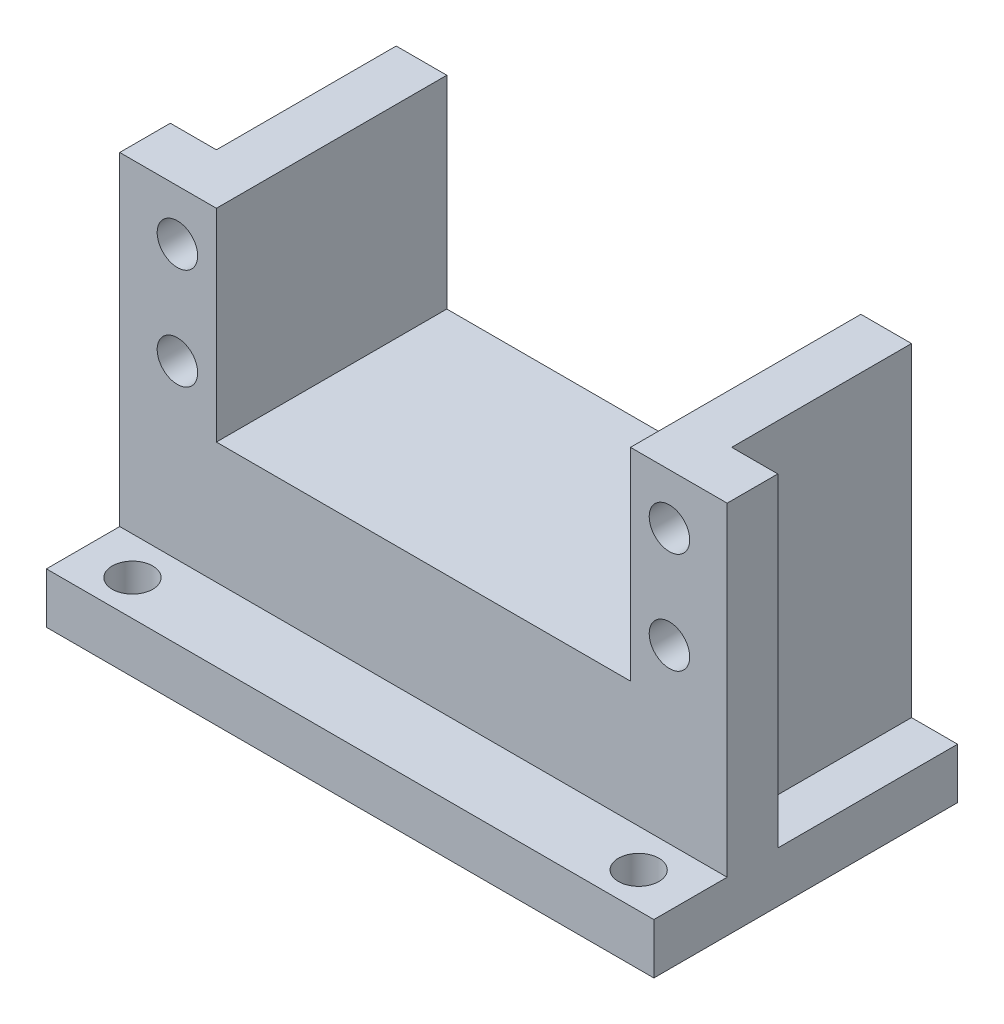
ISO-10303-21;
HEADER;
FILE_DESCRIPTION(('STEP AP214'),'2;1');
FILE_NAME('part.step','',(''),(''),'','','');
FILE_SCHEMA(('AUTOMOTIVE_DESIGN { 1 0 10303 214 1 1 1 1 }'));
ENDSEC;
DATA;
#1=APPLICATION_CONTEXT('core data for automotive mechanical design processes');
#2=APPLICATION_PROTOCOL_DEFINITION('international standard','automotive_design',2000,#1);
#3=PRODUCT_CONTEXT('',#1,'mechanical');
#4=PRODUCT('Part','Part','',(#3));
#5=PRODUCT_RELATED_PRODUCT_CATEGORY('part','',(#4));
#6=PRODUCT_DEFINITION_FORMATION('','',#4);
#7=PRODUCT_DEFINITION_CONTEXT('part definition',#1,'design');
#8=PRODUCT_DEFINITION('design','',#6,#7);
#9=PRODUCT_DEFINITION_SHAPE('','',#8);
#10=(LENGTH_UNIT() NAMED_UNIT(*) SI_UNIT(.MILLI.,.METRE.));
#11=(NAMED_UNIT(*) PLANE_ANGLE_UNIT() SI_UNIT($,.RADIAN.));
#12=(NAMED_UNIT(*) SI_UNIT($,.STERADIAN.) SOLID_ANGLE_UNIT());
#13=UNCERTAINTY_MEASURE_WITH_UNIT(LENGTH_MEASURE(1.E-05),#10,'distance_accuracy_value','');
#14=(GEOMETRIC_REPRESENTATION_CONTEXT(3) GLOBAL_UNCERTAINTY_ASSIGNED_CONTEXT((#13)) GLOBAL_UNIT_ASSIGNED_CONTEXT((#10,
#11,#12)) REPRESENTATION_CONTEXT('',''));
#15=CARTESIAN_POINT('',(0.,0.,0.));
#16=DIRECTION('',(0.,0.,1.));
#17=DIRECTION('',(1.,0.,0.));
#18=AXIS2_PLACEMENT_3D('',#15,#16,#17);
#19=CARTESIAN_POINT('',(0.,5.,0.));
#20=DIRECTION('',(0.,1.,0.));
#21=DIRECTION('',(0.,0.,1.));
#22=AXIS2_PLACEMENT_3D('',#19,#20,#21);
#23=PLANE('',#22);
#24=CARTESIAN_POINT('',(-25.,5.,11.5));
#25=DIRECTION('',(0.,1.,0.));
#26=DIRECTION('',(0.,0.,1.));
#27=AXIS2_PLACEMENT_3D('',#24,#25,#26);
#28=CIRCLE('',#27,2.);
#29=CARTESIAN_POINT('',(-25.,5.,13.5));
#30=VERTEX_POINT('',#29);
#31=EDGE_CURVE('E373',#30,#30,#28,.T.);
#32=ORIENTED_EDGE('',*,*,#31,.F.);
#33=EDGE_LOOP('',(#32));
#34=FACE_BOUND('',#33,.T.);
#35=CARTESIAN_POINT('',(25.,5.,11.5));
#36=DIRECTION('',(0.,1.,0.));
#37=DIRECTION('',(0.,0.,1.));
#38=AXIS2_PLACEMENT_3D('',#35,#36,#37);
#39=CIRCLE('',#38,2.);
#40=CARTESIAN_POINT('',(25.,5.,13.5));
#41=VERTEX_POINT('',#40);
#42=EDGE_CURVE('E370',#41,#41,#39,.T.);
#43=ORIENTED_EDGE('',*,*,#42,.F.);
#44=EDGE_LOOP('',(#43));
#45=FACE_BOUND('',#44,.T.);
#46=DIRECTION('',(0.,0.,-1.));
#47=VECTOR('',#46,1.);
#48=CARTESIAN_POINT('',(30.,5.,15.));
#49=LINE('',#48,#47);
#50=CARTESIAN_POINT('',(30.,5.,15.));
#51=VERTEX_POINT('',#50);
#52=CARTESIAN_POINT('',(30.,5.,7.76));
#53=VERTEX_POINT('',#52);
#54=EDGE_CURVE('E228',#51,#53,#49,.T.);
#55=ORIENTED_EDGE('',*,*,#54,.T.);
#56=DIRECTION('',(1.,0.,0.));
#57=VECTOR('',#56,1.);
#58=CARTESIAN_POINT('',(-30.,5.,7.76));
#59=LINE('',#58,#57);
#60=CARTESIAN_POINT('',(-30.,5.,7.76));
#61=VERTEX_POINT('',#60);
#62=EDGE_CURVE('E172',#61,#53,#59,.T.);
#63=ORIENTED_EDGE('',*,*,#62,.F.);
#64=DIRECTION('',(0.,0.,1.));
#65=VECTOR('',#64,1.);
#66=CARTESIAN_POINT('',(-30.,5.,15.));
#67=LINE('',#66,#65);
#68=CARTESIAN_POINT('',(-30.,5.,15.));
#69=VERTEX_POINT('',#68);
#70=EDGE_CURVE('E225',#61,#69,#67,.T.);
#71=ORIENTED_EDGE('',*,*,#70,.T.);
#72=DIRECTION('',(1.,0.,0.));
#73=VECTOR('',#72,1.);
#74=CARTESIAN_POINT('',(30.,5.,15.));
#75=LINE('',#74,#73);
#76=EDGE_CURVE('E224',#69,#51,#75,.T.);
#77=ORIENTED_EDGE('',*,*,#76,.T.);
#78=EDGE_LOOP('',(#55,#63,#71,#77));
#79=FACE_BOUND('',#78,.T.);
#80=ADVANCED_FACE('F38',(#34,#45,#79),#23,.T.);
#81=CARTESIAN_POINT('',(20.45,36.9999999999998,7.76));
#82=DIRECTION('',(1.,0.,0.));
#83=DIRECTION('',(0.,0.,-1.));
#84=AXIS2_PLACEMENT_3D('',#81,#82,#83);
#85=PLANE('',#84);
#86=DIRECTION('',(0.,0.,-1.));
#87=VECTOR('',#86,1.);
#88=CARTESIAN_POINT('',(20.45,16.9999999999998,-15.));
#89=LINE('',#88,#87);
#90=CARTESIAN_POINT('',(20.45,16.9999999999998,7.76));
#91=VERTEX_POINT('',#90);
#92=CARTESIAN_POINT('',(20.45,16.9999999999998,-15.));
#93=VERTEX_POINT('',#92);
#94=EDGE_CURVE('E58',#91,#93,#89,.T.);
#95=ORIENTED_EDGE('',*,*,#94,.F.);
#96=DIRECTION('',(0.,-1.,0.));
#97=VECTOR('',#96,1.);
#98=CARTESIAN_POINT('',(20.45,36.9999999999998,7.76));
#99=LINE('',#98,#97);
#100=CARTESIAN_POINT('',(20.45,36.9999999999998,7.76));
#101=VERTEX_POINT('',#100);
#102=EDGE_CURVE('E194',#101,#91,#99,.T.);
#103=ORIENTED_EDGE('',*,*,#102,.F.);
#104=DIRECTION('',(0.,0.,1.));
#105=VECTOR('',#104,1.);
#106=CARTESIAN_POINT('',(20.45,36.9999999999998,7.76));
#107=LINE('',#106,#105);
#108=CARTESIAN_POINT('',(20.45,36.9999999999998,-15.));
#109=VERTEX_POINT('',#108);
#110=EDGE_CURVE('E214',#109,#101,#107,.T.);
#111=ORIENTED_EDGE('',*,*,#110,.F.);
#112=DIRECTION('',(0.,-1.,0.));
#113=VECTOR('',#112,1.);
#114=CARTESIAN_POINT('',(20.45,36.9999999999998,-15.));
#115=LINE('',#114,#113);
#116=EDGE_CURVE('E53',#109,#93,#115,.T.);
#117=ORIENTED_EDGE('',*,*,#116,.T.);
#118=EDGE_LOOP('',(#95,#103,#111,#117));
#119=FACE_BOUND('',#118,.T.);
#120=ADVANCED_FACE('F302',(#119),#85,.F.);
#121=CARTESIAN_POINT('',(-20.45,36.9999999999998,7.76));
#122=DIRECTION('',(-1.,0.,0.));
#123=DIRECTION('',(0.,0.,1.));
#124=AXIS2_PLACEMENT_3D('',#121,#122,#123);
#125=PLANE('',#124);
#126=DIRECTION('',(0.,0.,1.));
#127=VECTOR('',#126,1.);
#128=CARTESIAN_POINT('',(-20.45,16.9999999999998,-15.));
#129=LINE('',#128,#127);
#130=CARTESIAN_POINT('',(-20.45,16.9999999999998,-15.));
#131=VERTEX_POINT('',#130);
#132=CARTESIAN_POINT('',(-20.45,16.9999999999998,7.76));
#133=VERTEX_POINT('',#132);
#134=EDGE_CURVE('E176',#131,#133,#129,.T.);
#135=ORIENTED_EDGE('',*,*,#134,.F.);
#136=DIRECTION('',(0.,-1.,0.));
#137=VECTOR('',#136,1.);
#138=CARTESIAN_POINT('',(-20.45,36.9999999999998,-15.));
#139=LINE('',#138,#137);
#140=CARTESIAN_POINT('',(-20.45,36.9999999999998,-15.));
#141=VERTEX_POINT('',#140);
#142=EDGE_CURVE('E156',#141,#131,#139,.T.);
#143=ORIENTED_EDGE('',*,*,#142,.F.);
#144=DIRECTION('',(0.,0.,-1.));
#145=VECTOR('',#144,1.);
#146=CARTESIAN_POINT('',(-20.45,36.9999999999998,7.76));
#147=LINE('',#146,#145);
#148=CARTESIAN_POINT('',(-20.45,36.9999999999998,7.76));
#149=VERTEX_POINT('',#148);
#150=EDGE_CURVE('E164',#149,#141,#147,.T.);
#151=ORIENTED_EDGE('',*,*,#150,.F.);
#152=DIRECTION('',(0.,-1.,0.));
#153=VECTOR('',#152,1.);
#154=CARTESIAN_POINT('',(-20.45,36.9999999999998,7.76));
#155=LINE('',#154,#153);
#156=EDGE_CURVE('E281',#149,#133,#155,.T.);
#157=ORIENTED_EDGE('',*,*,#156,.T.);
#158=EDGE_LOOP('',(#135,#143,#151,#157));
#159=FACE_BOUND('',#158,.T.);
#160=ADVANCED_FACE('F174',(#159),#125,.F.);
#161=DIRECTION('',(-1.,0.,0.));
#162=VECTOR('',#161,1.);
#163=CARTESIAN_POINT('',(-25.45,5.,2.76));
#164=LINE('',#163,#162);
#165=CARTESIAN_POINT('',(-25.45,5.,2.76));
#166=VERTEX_POINT('',#165);
#167=CARTESIAN_POINT('',(-30.,5.,2.76));
#168=VERTEX_POINT('',#167);
#169=EDGE_CURVE('E269',#166,#168,#164,.T.);
#170=ORIENTED_EDGE('',*,*,#169,.F.);
#171=DIRECTION('',(0.,0.,1.));
#172=VECTOR('',#171,1.);
#173=CARTESIAN_POINT('',(-25.45,5.,-15.));
#174=LINE('',#173,#172);
#175=CARTESIAN_POINT('',(-25.45,5.,-15.));
#176=VERTEX_POINT('',#175);
#177=EDGE_CURVE('E210',#176,#166,#174,.T.);
#178=ORIENTED_EDGE('',*,*,#177,.F.);
#179=DIRECTION('',(-1.,0.,0.));
#180=VECTOR('',#179,1.);
#181=CARTESIAN_POINT('',(30.,5.,-15.));
#182=LINE('',#181,#180);
#183=CARTESIAN_POINT('',(-30.,5.,-15.));
#184=VERTEX_POINT('',#183);
#185=EDGE_CURVE('E231',#176,#184,#182,.T.);
#186=ORIENTED_EDGE('',*,*,#185,.T.);
#187=EDGE_CURVE('E222',#184,#168,#67,.T.);
#188=ORIENTED_EDGE('',*,*,#187,.T.);
#189=EDGE_LOOP('',(#170,#178,#186,#188));
#190=FACE_BOUND('',#189,.T.);
#191=ADVANCED_FACE('F268',(#190),#23,.T.);
#192=CARTESIAN_POINT('',(-30.,5.,15.));
#193=DIRECTION('',(1.,0.,0.));
#194=DIRECTION('',(0.,0.,-1.));
#195=AXIS2_PLACEMENT_3D('',#192,#193,#194);
#196=PLANE('',#195);
#197=DIRECTION('',(0.,0.,1.));
#198=VECTOR('',#197,1.);
#199=CARTESIAN_POINT('',(-30.,0.,15.));
#200=LINE('',#199,#198);
#201=CARTESIAN_POINT('',(-30.,0.,-15.));
#202=VERTEX_POINT('',#201);
#203=CARTESIAN_POINT('',(-30.,0.,15.));
#204=VERTEX_POINT('',#203);
#205=EDGE_CURVE('E177',#202,#204,#200,.T.);
#206=ORIENTED_EDGE('',*,*,#205,.T.);
#207=DIRECTION('',(0.,-1.,0.));
#208=VECTOR('',#207,1.);
#209=CARTESIAN_POINT('',(-30.,5.,15.));
#210=LINE('',#209,#208);
#211=EDGE_CURVE('E11',#69,#204,#210,.T.);
#212=ORIENTED_EDGE('',*,*,#211,.F.);
#213=ORIENTED_EDGE('',*,*,#70,.F.);
#214=DIRECTION('',(0.,-1.,0.));
#215=VECTOR('',#214,1.);
#216=CARTESIAN_POINT('',(-30.,36.9999999999998,7.76));
#217=LINE('',#216,#215);
#218=CARTESIAN_POINT('',(-30.,36.9999999999998,7.76));
#219=VERTEX_POINT('',#218);
#220=EDGE_CURVE('E283',#219,#61,#217,.T.);
#221=ORIENTED_EDGE('',*,*,#220,.F.);
#222=DIRECTION('',(0.,0.,1.));
#223=VECTOR('',#222,1.);
#224=CARTESIAN_POINT('',(-30.,36.9999999999998,2.76));
#225=LINE('',#224,#223);
#226=CARTESIAN_POINT('',(-30.,36.9999999999998,2.76));
#227=VERTEX_POINT('',#226);
#228=EDGE_CURVE('E291',#227,#219,#225,.T.);
#229=ORIENTED_EDGE('',*,*,#228,.F.);
#230=DIRECTION('',(0.,-1.,0.));
#231=VECTOR('',#230,1.);
#232=CARTESIAN_POINT('',(-30.,36.9999999999998,2.76));
#233=LINE('',#232,#231);
#234=EDGE_CURVE('E265',#227,#168,#233,.T.);
#235=ORIENTED_EDGE('',*,*,#234,.T.);
#236=ORIENTED_EDGE('',*,*,#187,.F.);
#237=DIRECTION('',(0.,-1.,0.));
#238=VECTOR('',#237,1.);
#239=CARTESIAN_POINT('',(-30.,5.,-15.));
#240=LINE('',#239,#238);
#241=EDGE_CURVE('E233',#184,#202,#240,.T.);
#242=ORIENTED_EDGE('',*,*,#241,.T.);
#243=EDGE_LOOP('',(#206,#212,#213,#221,#229,#235,#236,#242));
#244=FACE_BOUND('',#243,.T.);
#245=ADVANCED_FACE('F40',(#244),#196,.F.);
#246=CARTESIAN_POINT('',(30.,5.,15.));
#247=DIRECTION('',(0.,0.,-1.));
#248=DIRECTION('',(-1.,0.,0.));
#249=AXIS2_PLACEMENT_3D('',#246,#247,#248);
#250=PLANE('',#249);
#251=DIRECTION('',(1.,0.,0.));
#252=VECTOR('',#251,1.);
#253=CARTESIAN_POINT('',(30.,0.,15.));
#254=LINE('',#253,#252);
#255=CARTESIAN_POINT('',(30.,0.,15.));
#256=VERTEX_POINT('',#255);
#257=EDGE_CURVE('E180',#204,#256,#254,.T.);
#258=ORIENTED_EDGE('',*,*,#257,.T.);
#259=DIRECTION('',(0.,-1.,0.));
#260=VECTOR('',#259,1.);
#261=CARTESIAN_POINT('',(30.,5.,15.));
#262=LINE('',#261,#260);
#263=EDGE_CURVE('E46',#51,#256,#262,.T.);
#264=ORIENTED_EDGE('',*,*,#263,.F.);
#265=ORIENTED_EDGE('',*,*,#76,.F.);
#266=ORIENTED_EDGE('',*,*,#211,.T.);
#267=EDGE_LOOP('',(#258,#264,#265,#266));
#268=FACE_BOUND('',#267,.T.);
#269=ADVANCED_FACE('F293',(#268),#250,.F.);
#270=CARTESIAN_POINT('',(30.,5.,15.));
#271=DIRECTION('',(-1.,0.,0.));
#272=DIRECTION('',(0.,0.,1.));
#273=AXIS2_PLACEMENT_3D('',#270,#271,#272);
#274=PLANE('',#273);
#275=DIRECTION('',(0.,0.,-1.));
#276=VECTOR('',#275,1.);
#277=CARTESIAN_POINT('',(30.,0.,15.));
#278=LINE('',#277,#276);
#279=CARTESIAN_POINT('',(30.,0.,-15.));
#280=VERTEX_POINT('',#279);
#281=EDGE_CURVE('E236',#256,#280,#278,.T.);
#282=ORIENTED_EDGE('',*,*,#281,.T.);
#283=DIRECTION('',(0.,-1.,0.));
#284=VECTOR('',#283,1.);
#285=CARTESIAN_POINT('',(30.,5.,-15.));
#286=LINE('',#285,#284);
#287=CARTESIAN_POINT('',(30.,5.,-15.));
#288=VERTEX_POINT('',#287);
#289=EDGE_CURVE('E242',#288,#280,#286,.T.);
#290=ORIENTED_EDGE('',*,*,#289,.F.);
#291=CARTESIAN_POINT('',(30.,5.,2.76));
#292=VERTEX_POINT('',#291);
#293=EDGE_CURVE('E227',#292,#288,#49,.T.);
#294=ORIENTED_EDGE('',*,*,#293,.F.);
#295=DIRECTION('',(0.,-1.,0.));
#296=VECTOR('',#295,1.);
#297=CARTESIAN_POINT('',(30.,36.9999999999998,2.76));
#298=LINE('',#297,#296);
#299=CARTESIAN_POINT('',(30.,36.9999999999998,2.76));
#300=VERTEX_POINT('',#299);
#301=EDGE_CURVE('E199',#300,#292,#298,.T.);
#302=ORIENTED_EDGE('',*,*,#301,.F.);
#303=DIRECTION('',(0.,0.,-1.));
#304=VECTOR('',#303,1.);
#305=CARTESIAN_POINT('',(30.,36.9999999999998,2.76));
#306=LINE('',#305,#304);
#307=CARTESIAN_POINT('',(30.,36.9999999999998,7.76));
#308=VERTEX_POINT('',#307);
#309=EDGE_CURVE('E202',#308,#300,#306,.T.);
#310=ORIENTED_EDGE('',*,*,#309,.F.);
#311=DIRECTION('',(0.,-1.,0.));
#312=VECTOR('',#311,1.);
#313=CARTESIAN_POINT('',(30.,36.9999999999998,7.76));
#314=LINE('',#313,#312);
#315=EDGE_CURVE('E196',#308,#53,#314,.T.);
#316=ORIENTED_EDGE('',*,*,#315,.T.);
#317=ORIENTED_EDGE('',*,*,#54,.F.);
#318=ORIENTED_EDGE('',*,*,#263,.T.);
#319=EDGE_LOOP('',(#282,#290,#294,#302,#310,#316,#317,#318));
#320=FACE_BOUND('',#319,.T.);
#321=ADVANCED_FACE('F249',(#320),#274,.F.);
#322=CARTESIAN_POINT('',(30.,5.,-15.));
#323=DIRECTION('',(0.,0.,1.));
#324=DIRECTION('',(1.,0.,0.));
#325=AXIS2_PLACEMENT_3D('',#322,#323,#324);
#326=PLANE('',#325);
#327=DIRECTION('',(-1.,0.,0.));
#328=VECTOR('',#327,1.);
#329=CARTESIAN_POINT('',(30.,0.,-15.));
#330=LINE('',#329,#328);
#331=EDGE_CURVE('E238',#280,#202,#330,.T.);
#332=ORIENTED_EDGE('',*,*,#331,.T.);
#333=ORIENTED_EDGE('',*,*,#241,.F.);
#334=ORIENTED_EDGE('',*,*,#185,.F.);
#335=DIRECTION('',(0.,-1.,0.));
#336=VECTOR('',#335,1.);
#337=CARTESIAN_POINT('',(-25.45,36.9999999999998,-15.));
#338=LINE('',#337,#336);
#339=CARTESIAN_POINT('',(-25.45,36.9999999999998,-15.));
#340=VERTEX_POINT('',#339);
#341=EDGE_CURVE('E160',#340,#176,#338,.T.);
#342=ORIENTED_EDGE('',*,*,#341,.F.);
#343=DIRECTION('',(-1.,0.,0.));
#344=VECTOR('',#343,1.);
#345=CARTESIAN_POINT('',(-20.45,36.9999999999998,-15.));
#346=LINE('',#345,#344);
#347=EDGE_CURVE('E152',#141,#340,#346,.T.);
#348=ORIENTED_EDGE('',*,*,#347,.F.);
#349=ORIENTED_EDGE('',*,*,#142,.T.);
#350=DIRECTION('',(-1.,0.,0.));
#351=VECTOR('',#350,1.);
#352=CARTESIAN_POINT('',(20.45,16.9999999999998,-15.));
#353=LINE('',#352,#351);
#354=EDGE_CURVE('E340',#93,#131,#353,.T.);
#355=ORIENTED_EDGE('',*,*,#354,.F.);
#356=ORIENTED_EDGE('',*,*,#116,.F.);
#357=DIRECTION('',(-1.,0.,0.));
#358=VECTOR('',#357,1.);
#359=CARTESIAN_POINT('',(20.45,36.9999999999998,-15.));
#360=LINE('',#359,#358);
#361=CARTESIAN_POINT('',(25.45,36.9999999999998,-15.));
#362=VERTEX_POINT('',#361);
#363=EDGE_CURVE('E216',#362,#109,#360,.T.);
#364=ORIENTED_EDGE('',*,*,#363,.F.);
#365=DIRECTION('',(0.,-1.,0.));
#366=VECTOR('',#365,1.);
#367=CARTESIAN_POINT('',(25.45,36.9999999999998,-15.));
#368=LINE('',#367,#366);
#369=CARTESIAN_POINT('',(25.45,5.,-15.));
#370=VERTEX_POINT('',#369);
#371=EDGE_CURVE('E189',#362,#370,#368,.T.);
#372=ORIENTED_EDGE('',*,*,#371,.T.);
#373=EDGE_CURVE('E232',#288,#370,#182,.T.);
#374=ORIENTED_EDGE('',*,*,#373,.F.);
#375=ORIENTED_EDGE('',*,*,#289,.T.);
#376=EDGE_LOOP('',(#332,#333,#334,#342,#348,#349,#355,#356,#364,#372,#374,#375));
#377=FACE_BOUND('',#376,.T.);
#378=ADVANCED_FACE('F154',(#377),#326,.F.);
#379=DIRECTION('',(-1.,0.,0.));
#380=VECTOR('',#379,1.);
#381=CARTESIAN_POINT('',(25.45,5.,2.76));
#382=LINE('',#381,#380);
#383=CARTESIAN_POINT('',(25.45,5.,2.76));
#384=VERTEX_POINT('',#383);
#385=EDGE_CURVE('E206',#292,#384,#382,.T.);
#386=ORIENTED_EDGE('',*,*,#385,.F.);
#387=ORIENTED_EDGE('',*,*,#293,.T.);
#388=ORIENTED_EDGE('',*,*,#373,.T.);
#389=DIRECTION('',(0.,0.,-1.));
#390=VECTOR('',#389,1.);
#391=CARTESIAN_POINT('',(25.45,5.,-15.));
#392=LINE('',#391,#390);
#393=EDGE_CURVE('E203',#384,#370,#392,.T.);
#394=ORIENTED_EDGE('',*,*,#393,.F.);
#395=EDGE_LOOP('',(#386,#387,#388,#394));
#396=FACE_BOUND('',#395,.T.);
#397=ADVANCED_FACE('F305',(#396),#23,.T.);
#398=CARTESIAN_POINT('',(0.,0.,0.));
#399=DIRECTION('',(0.,1.,0.));
#400=DIRECTION('',(0.,0.,1.));
#401=AXIS2_PLACEMENT_3D('',#398,#399,#400);
#402=PLANE('',#401);
#403=CARTESIAN_POINT('',(-25.,0.,11.5));
#404=DIRECTION('',(0.,1.,0.));
#405=DIRECTION('',(0.,0.,1.));
#406=AXIS2_PLACEMENT_3D('',#403,#404,#405);
#407=CIRCLE('',#406,2.);
#408=CARTESIAN_POINT('',(-25.,0.,13.5));
#409=VERTEX_POINT('',#408);
#410=EDGE_CURVE('E367',#409,#409,#407,.F.);
#411=ORIENTED_EDGE('',*,*,#410,.F.);
#412=EDGE_LOOP('',(#411));
#413=FACE_BOUND('',#412,.T.);
#414=CARTESIAN_POINT('',(25.,0.,11.5));
#415=DIRECTION('',(0.,1.,0.));
#416=DIRECTION('',(0.,0.,1.));
#417=AXIS2_PLACEMENT_3D('',#414,#415,#416);
#418=CIRCLE('',#417,2.);
#419=CARTESIAN_POINT('',(25.,0.,13.5));
#420=VERTEX_POINT('',#419);
#421=EDGE_CURVE('E374',#420,#420,#418,.F.);
#422=ORIENTED_EDGE('',*,*,#421,.F.);
#423=EDGE_LOOP('',(#422));
#424=FACE_BOUND('',#423,.T.);
#425=ORIENTED_EDGE('',*,*,#205,.F.);
#426=ORIENTED_EDGE('',*,*,#331,.F.);
#427=ORIENTED_EDGE('',*,*,#281,.F.);
#428=ORIENTED_EDGE('',*,*,#257,.F.);
#429=EDGE_LOOP('',(#425,#426,#427,#428));
#430=FACE_BOUND('',#429,.T.);
#431=ADVANCED_FACE('F256',(#413,#424,#430),#402,.F.);
#432=CARTESIAN_POINT('',(25.45,36.9999999999998,2.76));
#433=DIRECTION('',(0.,0.,1.));
#434=DIRECTION('',(1.,0.,0.));
#435=AXIS2_PLACEMENT_3D('',#432,#433,#434);
#436=PLANE('',#435);
#437=ORIENTED_EDGE('',*,*,#385,.T.);
#438=DIRECTION('',(0.,-1.,0.));
#439=VECTOR('',#438,1.);
#440=CARTESIAN_POINT('',(25.45,36.9999999999998,2.76));
#441=LINE('',#440,#439);
#442=CARTESIAN_POINT('',(25.45,36.9999999999998,2.76));
#443=VERTEX_POINT('',#442);
#444=EDGE_CURVE('E186',#443,#384,#441,.T.);
#445=ORIENTED_EDGE('',*,*,#444,.F.);
#446=DIRECTION('',(-1.,0.,0.));
#447=VECTOR('',#446,1.);
#448=CARTESIAN_POINT('',(25.45,36.9999999999998,2.76));
#449=LINE('',#448,#447);
#450=EDGE_CURVE('E207',#300,#443,#449,.T.);
#451=ORIENTED_EDGE('',*,*,#450,.F.);
#452=ORIENTED_EDGE('',*,*,#301,.T.);
#453=EDGE_LOOP('',(#437,#445,#451,#452));
#454=FACE_BOUND('',#453,.T.);
#455=ADVANCED_FACE('F321',(#454),#436,.F.);
#456=CARTESIAN_POINT('',(25.45,36.9999999999998,-15.));
#457=DIRECTION('',(-1.,0.,0.));
#458=DIRECTION('',(0.,0.,1.));
#459=AXIS2_PLACEMENT_3D('',#456,#457,#458);
#460=PLANE('',#459);
#461=ORIENTED_EDGE('',*,*,#393,.T.);
#462=ORIENTED_EDGE('',*,*,#371,.F.);
#463=DIRECTION('',(0.,0.,-1.));
#464=VECTOR('',#463,1.);
#465=CARTESIAN_POINT('',(25.45,36.9999999999998,-15.));
#466=LINE('',#465,#464);
#467=EDGE_CURVE('E218',#443,#362,#466,.T.);
#468=ORIENTED_EDGE('',*,*,#467,.F.);
#469=ORIENTED_EDGE('',*,*,#444,.T.);
#470=EDGE_LOOP('',(#461,#462,#468,#469));
#471=FACE_BOUND('',#470,.T.);
#472=ADVANCED_FACE('F356',(#471),#460,.F.);
#473=CARTESIAN_POINT('',(0.,36.9999999999998,0.));
#474=DIRECTION('',(0.,-1.,0.));
#475=DIRECTION('',(0.,0.,-1.));
#476=AXIS2_PLACEMENT_3D('',#473,#474,#475);
#477=PLANE('',#476);
#478=ORIENTED_EDGE('',*,*,#450,.T.);
#479=ORIENTED_EDGE('',*,*,#467,.T.);
#480=ORIENTED_EDGE('',*,*,#363,.T.);
#481=ORIENTED_EDGE('',*,*,#110,.T.);
#482=DIRECTION('',(1.,0.,0.));
#483=VECTOR('',#482,1.);
#484=CARTESIAN_POINT('',(30.,36.9999999999998,7.76));
#485=LINE('',#484,#483);
#486=EDGE_CURVE('E212',#101,#308,#485,.T.);
#487=ORIENTED_EDGE('',*,*,#486,.T.);
#488=ORIENTED_EDGE('',*,*,#309,.T.);
#489=EDGE_LOOP('',(#478,#479,#480,#481,#487,#488));
#490=FACE_BOUND('',#489,.T.);
#491=ADVANCED_FACE('F332',(#490),#477,.F.);
#492=CARTESIAN_POINT('',(-25.45,36.9999999999998,-15.));
#493=DIRECTION('',(1.,0.,0.));
#494=DIRECTION('',(0.,0.,-1.));
#495=AXIS2_PLACEMENT_3D('',#492,#493,#494);
#496=PLANE('',#495);
#497=ORIENTED_EDGE('',*,*,#177,.T.);
#498=DIRECTION('',(0.,-1.,0.));
#499=VECTOR('',#498,1.);
#500=CARTESIAN_POINT('',(-25.45,36.9999999999998,2.76));
#501=LINE('',#500,#499);
#502=CARTESIAN_POINT('',(-25.45,36.9999999999998,2.76));
#503=VERTEX_POINT('',#502);
#504=EDGE_CURVE('E182',#503,#166,#501,.T.);
#505=ORIENTED_EDGE('',*,*,#504,.F.);
#506=DIRECTION('',(0.,0.,1.));
#507=VECTOR('',#506,1.);
#508=CARTESIAN_POINT('',(-25.45,36.9999999999998,-15.));
#509=LINE('',#508,#507);
#510=EDGE_CURVE('E163',#340,#503,#509,.T.);
#511=ORIENTED_EDGE('',*,*,#510,.F.);
#512=ORIENTED_EDGE('',*,*,#341,.T.);
#513=EDGE_LOOP('',(#497,#505,#511,#512));
#514=FACE_BOUND('',#513,.T.);
#515=ADVANCED_FACE('F348',(#514),#496,.F.);
#516=CARTESIAN_POINT('',(-25.45,36.9999999999998,2.76));
#517=DIRECTION('',(0.,0.,1.));
#518=DIRECTION('',(1.,0.,0.));
#519=AXIS2_PLACEMENT_3D('',#516,#517,#518);
#520=PLANE('',#519);
#521=ORIENTED_EDGE('',*,*,#169,.T.);
#522=ORIENTED_EDGE('',*,*,#234,.F.);
#523=DIRECTION('',(-1.,0.,0.));
#524=VECTOR('',#523,1.);
#525=CARTESIAN_POINT('',(-25.45,36.9999999999998,2.76));
#526=LINE('',#525,#524);
#527=EDGE_CURVE('E345',#503,#227,#526,.T.);
#528=ORIENTED_EDGE('',*,*,#527,.F.);
#529=ORIENTED_EDGE('',*,*,#504,.T.);
#530=EDGE_LOOP('',(#521,#522,#528,#529));
#531=FACE_BOUND('',#530,.T.);
#532=ADVANCED_FACE('F273',(#531),#520,.F.);
#533=CARTESIAN_POINT('',(-30.,36.9999999999998,7.76));
#534=DIRECTION('',(0.,0.,-1.));
#535=DIRECTION('',(-1.,0.,0.));
#536=AXIS2_PLACEMENT_3D('',#533,#534,#535);
#537=PLANE('',#536);
#538=CARTESIAN_POINT('',(-24.3,32.,7.76));
#539=DIRECTION('',(0.,0.,1.));
#540=DIRECTION('',(1.,0.,0.));
#541=AXIS2_PLACEMENT_3D('',#538,#539,#540);
#542=CIRCLE('',#541,2.00000000000001);
#543=CARTESIAN_POINT('',(-22.3,32.,7.76));
#544=VERTEX_POINT('',#543);
#545=EDGE_CURVE('E385',#544,#544,#542,.T.);
#546=ORIENTED_EDGE('',*,*,#545,.F.);
#547=EDGE_LOOP('',(#546));
#548=FACE_BOUND('',#547,.T.);
#549=CARTESIAN_POINT('',(24.3,22.,7.76));
#550=DIRECTION('',(0.,0.,1.));
#551=DIRECTION('',(-1.,0.,0.));
#552=AXIS2_PLACEMENT_3D('',#549,#550,#551);
#553=CIRCLE('',#552,2.00000000000001);
#554=CARTESIAN_POINT('',(22.3,22.,7.76));
#555=VERTEX_POINT('',#554);
#556=EDGE_CURVE('E391',#555,#555,#553,.T.);
#557=ORIENTED_EDGE('',*,*,#556,.F.);
#558=EDGE_LOOP('',(#557));
#559=FACE_BOUND('',#558,.T.);
#560=CARTESIAN_POINT('',(24.3,32.,7.76));
#561=DIRECTION('',(0.,0.,1.));
#562=DIRECTION('',(-1.,0.,0.));
#563=AXIS2_PLACEMENT_3D('',#560,#561,#562);
#564=CIRCLE('',#563,2.00000000000001);
#565=CARTESIAN_POINT('',(22.3,32.,7.76));
#566=VERTEX_POINT('',#565);
#567=EDGE_CURVE('E392',#566,#566,#564,.T.);
#568=ORIENTED_EDGE('',*,*,#567,.F.);
#569=EDGE_LOOP('',(#568));
#570=FACE_BOUND('',#569,.T.);
#571=CARTESIAN_POINT('',(-24.3,22.,7.76));
#572=DIRECTION('',(0.,0.,1.));
#573=DIRECTION('',(1.,0.,0.));
#574=AXIS2_PLACEMENT_3D('',#571,#572,#573);
#575=CIRCLE('',#574,2.00000000000001);
#576=CARTESIAN_POINT('',(-22.3,22.,7.76));
#577=VERTEX_POINT('',#576);
#578=EDGE_CURVE('E382',#577,#577,#575,.T.);
#579=ORIENTED_EDGE('',*,*,#578,.F.);
#580=EDGE_LOOP('',(#579));
#581=FACE_BOUND('',#580,.T.);
#582=ORIENTED_EDGE('',*,*,#62,.T.);
#583=ORIENTED_EDGE('',*,*,#315,.F.);
#584=ORIENTED_EDGE('',*,*,#486,.F.);
#585=ORIENTED_EDGE('',*,*,#102,.T.);
#586=DIRECTION('',(1.,0.,0.));
#587=VECTOR('',#586,1.);
#588=CARTESIAN_POINT('',(20.45,16.9999999999998,7.75999999999999));
#589=LINE('',#588,#587);
#590=EDGE_CURVE('E190',#133,#91,#589,.T.);
#591=ORIENTED_EDGE('',*,*,#590,.F.);
#592=ORIENTED_EDGE('',*,*,#156,.F.);
#593=DIRECTION('',(1.,0.,0.));
#594=VECTOR('',#593,1.);
#595=CARTESIAN_POINT('',(-30.,36.9999999999998,7.76));
#596=LINE('',#595,#594);
#597=EDGE_CURVE('E169',#219,#149,#596,.T.);
#598=ORIENTED_EDGE('',*,*,#597,.F.);
#599=ORIENTED_EDGE('',*,*,#220,.T.);
#600=EDGE_LOOP('',(#582,#583,#584,#585,#591,#592,#598,#599));
#601=FACE_BOUND('',#600,.T.);
#602=ADVANCED_FACE('F288',(#548,#559,#570,#581,#601),#537,.F.);
#603=CARTESIAN_POINT('',(0.,36.9999999999998,0.));
#604=DIRECTION('',(0.,1.,0.));
#605=DIRECTION('',(0.,0.,1.));
#606=AXIS2_PLACEMENT_3D('',#603,#604,#605);
#607=PLANE('',#606);
#608=ORIENTED_EDGE('',*,*,#150,.T.);
#609=ORIENTED_EDGE('',*,*,#347,.T.);
#610=ORIENTED_EDGE('',*,*,#510,.T.);
#611=ORIENTED_EDGE('',*,*,#527,.T.);
#612=ORIENTED_EDGE('',*,*,#228,.T.);
#613=ORIENTED_EDGE('',*,*,#597,.T.);
#614=EDGE_LOOP('',(#608,#609,#610,#611,#612,#613));
#615=FACE_BOUND('',#614,.T.);
#616=ADVANCED_FACE('F167',(#615),#607,.T.);
#617=CARTESIAN_POINT('',(0.,16.9999999999998,0.));
#618=DIRECTION('',(0.,-1.,0.));
#619=DIRECTION('',(0.,0.,-1.));
#620=AXIS2_PLACEMENT_3D('',#617,#618,#619);
#621=PLANE('',#620);
#622=ORIENTED_EDGE('',*,*,#94,.T.);
#623=ORIENTED_EDGE('',*,*,#354,.T.);
#624=ORIENTED_EDGE('',*,*,#134,.T.);
#625=ORIENTED_EDGE('',*,*,#590,.T.);
#626=EDGE_LOOP('',(#622,#623,#624,#625));
#627=FACE_BOUND('',#626,.T.);
#628=ADVANCED_FACE('F338',(#627),#621,.F.);
#629=CARTESIAN_POINT('',(25.,-5.65685424949239,11.5));
#630=DIRECTION('',(0.,1.,0.));
#631=DIRECTION('',(0.,0.,1.));
#632=AXIS2_PLACEMENT_3D('',#629,#630,#631);
#633=CYLINDRICAL_SURFACE('',#632,2.);
#634=ORIENTED_EDGE('',*,*,#421,.T.);
#635=EDGE_LOOP('',(#634));
#636=FACE_BOUND('',#635,.T.);
#637=ORIENTED_EDGE('',*,*,#42,.T.);
#638=EDGE_LOOP('',(#637));
#639=FACE_BOUND('',#638,.T.);
#640=ADVANCED_FACE('F425',(#636,#639),#633,.F.);
#641=CARTESIAN_POINT('',(-25.,-5.65685424949239,11.5));
#642=DIRECTION('',(0.,1.,0.));
#643=DIRECTION('',(0.,0.,1.));
#644=AXIS2_PLACEMENT_3D('',#641,#642,#643);
#645=CYLINDRICAL_SURFACE('',#644,2.);
#646=ORIENTED_EDGE('',*,*,#410,.T.);
#647=EDGE_LOOP('',(#646));
#648=FACE_BOUND('',#647,.T.);
#649=ORIENTED_EDGE('',*,*,#31,.T.);
#650=EDGE_LOOP('',(#649));
#651=FACE_BOUND('',#650,.T.);
#652=ADVANCED_FACE('F416',(#648,#651),#645,.F.);
#653=CARTESIAN_POINT('',(-24.3,22.,3.75999999999999));
#654=DIRECTION('',(0.,0.,1.));
#655=DIRECTION('',(1.,0.,0.));
#656=AXIS2_PLACEMENT_3D('',#653,#654,#655);
#657=CYLINDRICAL_SURFACE('',#656,2.00000000000001);
#658=CARTESIAN_POINT('',(-24.3,22.,3.75999999999999));
#659=DIRECTION('',(0.,0.,1.));
#660=DIRECTION('',(1.,0.,0.));
#661=AXIS2_PLACEMENT_3D('',#658,#659,#660);
#662=CIRCLE('',#661,2.00000000000001);
#663=CARTESIAN_POINT('',(-22.3,22.,3.75999999999999));
#664=VERTEX_POINT('',#663);
#665=EDGE_CURVE('E377',#664,#664,#662,.T.);
#666=ORIENTED_EDGE('',*,*,#665,.F.);
#667=EDGE_LOOP('',(#666));
#668=FACE_BOUND('',#667,.T.);
#669=ORIENTED_EDGE('',*,*,#578,.T.);
#670=EDGE_LOOP('',(#669));
#671=FACE_BOUND('',#670,.T.);
#672=ADVANCED_FACE('F413',(#668,#671),#657,.F.);
#673=CARTESIAN_POINT('',(-24.3,22.,3.75999999999999));
#674=DIRECTION('',(0.,0.,1.));
#675=DIRECTION('',(1.,0.,0.));
#676=AXIS2_PLACEMENT_3D('',#673,#674,#675);
#677=PLANE('',#676);
#678=ORIENTED_EDGE('',*,*,#665,.T.);
#679=EDGE_LOOP('',(#678));
#680=FACE_BOUND('',#679,.T.);
#681=ADVANCED_FACE('F415',(#680),#677,.T.);
#682=CARTESIAN_POINT('',(24.3,32.,3.75999999999999));
#683=DIRECTION('',(0.,0.,1.));
#684=DIRECTION('',(1.,0.,0.));
#685=AXIS2_PLACEMENT_3D('',#682,#683,#684);
#686=CYLINDRICAL_SURFACE('',#685,2.00000000000001);
#687=CARTESIAN_POINT('',(24.3,32.,3.75999999999999));
#688=DIRECTION('',(0.,0.,1.));
#689=DIRECTION('',(-1.,0.,0.));
#690=AXIS2_PLACEMENT_3D('',#687,#688,#689);
#691=CIRCLE('',#690,2.00000000000001);
#692=CARTESIAN_POINT('',(22.3,32.,3.75999999999999));
#693=VERTEX_POINT('',#692);
#694=EDGE_CURVE('E400',#693,#693,#691,.T.);
#695=ORIENTED_EDGE('',*,*,#694,.F.);
#696=EDGE_LOOP('',(#695));
#697=FACE_BOUND('',#696,.T.);
#698=ORIENTED_EDGE('',*,*,#567,.T.);
#699=EDGE_LOOP('',(#698));
#700=FACE_BOUND('',#699,.T.);
#701=ADVANCED_FACE('F406',(#697,#700),#686,.F.);
#702=CARTESIAN_POINT('',(24.3,32.,3.75999999999999));
#703=DIRECTION('',(0.,0.,-1.));
#704=DIRECTION('',(-1.,0.,0.));
#705=AXIS2_PLACEMENT_3D('',#702,#703,#704);
#706=PLANE('',#705);
#707=ORIENTED_EDGE('',*,*,#694,.T.);
#708=EDGE_LOOP('',(#707));
#709=FACE_BOUND('',#708,.T.);
#710=ADVANCED_FACE('F495',(#709),#706,.F.);
#711=CARTESIAN_POINT('',(24.3,22.,3.75999999999999));
#712=DIRECTION('',(0.,0.,1.));
#713=DIRECTION('',(1.,0.,0.));
#714=AXIS2_PLACEMENT_3D('',#711,#712,#713);
#715=CYLINDRICAL_SURFACE('',#714,2.00000000000001);
#716=CARTESIAN_POINT('',(24.3,22.,3.75999999999999));
#717=DIRECTION('',(0.,0.,1.));
#718=DIRECTION('',(-1.,0.,0.));
#719=AXIS2_PLACEMENT_3D('',#716,#717,#718);
#720=CIRCLE('',#719,2.00000000000001);
#721=CARTESIAN_POINT('',(22.3,22.,3.75999999999999));
#722=VERTEX_POINT('',#721);
#723=EDGE_CURVE('E388',#722,#722,#720,.T.);
#724=ORIENTED_EDGE('',*,*,#723,.F.);
#725=EDGE_LOOP('',(#724));
#726=FACE_BOUND('',#725,.T.);
#727=ORIENTED_EDGE('',*,*,#556,.T.);
#728=EDGE_LOOP('',(#727));
#729=FACE_BOUND('',#728,.T.);
#730=ADVANCED_FACE('F505',(#726,#729),#715,.F.);
#731=CARTESIAN_POINT('',(24.3,22.,3.75999999999999));
#732=DIRECTION('',(0.,0.,-1.));
#733=DIRECTION('',(-1.,0.,0.));
#734=AXIS2_PLACEMENT_3D('',#731,#732,#733);
#735=PLANE('',#734);
#736=ORIENTED_EDGE('',*,*,#723,.T.);
#737=EDGE_LOOP('',(#736));
#738=FACE_BOUND('',#737,.T.);
#739=ADVANCED_FACE('F515',(#738),#735,.F.);
#740=CARTESIAN_POINT('',(-24.3,32.,3.75999999999999));
#741=DIRECTION('',(0.,0.,1.));
#742=DIRECTION('',(1.,0.,0.));
#743=AXIS2_PLACEMENT_3D('',#740,#741,#742);
#744=CYLINDRICAL_SURFACE('',#743,2.00000000000001);
#745=CARTESIAN_POINT('',(-24.3,32.,3.75999999999999));
#746=DIRECTION('',(0.,0.,1.));
#747=DIRECTION('',(1.,0.,0.));
#748=AXIS2_PLACEMENT_3D('',#745,#746,#747);
#749=CIRCLE('',#748,2.00000000000001);
#750=CARTESIAN_POINT('',(-22.3,32.,3.75999999999999));
#751=VERTEX_POINT('',#750);
#752=EDGE_CURVE('E395',#751,#751,#749,.T.);
#753=ORIENTED_EDGE('',*,*,#752,.F.);
#754=EDGE_LOOP('',(#753));
#755=FACE_BOUND('',#754,.T.);
#756=ORIENTED_EDGE('',*,*,#545,.T.);
#757=EDGE_LOOP('',(#756));
#758=FACE_BOUND('',#757,.T.);
#759=ADVANCED_FACE('F525',(#755,#758),#744,.F.);
#760=CARTESIAN_POINT('',(-24.3,32.,3.75999999999999));
#761=DIRECTION('',(0.,0.,1.));
#762=DIRECTION('',(1.,0.,0.));
#763=AXIS2_PLACEMENT_3D('',#760,#761,#762);
#764=PLANE('',#763);
#765=ORIENTED_EDGE('',*,*,#752,.T.);
#766=EDGE_LOOP('',(#765));
#767=FACE_BOUND('',#766,.T.);
#768=ADVANCED_FACE('F534',(#767),#764,.T.);
#769=CLOSED_SHELL('',(#80,#120,#160,#191,#245,#269,#321,#378,#397,#431,#455,#472,#491,#515,#532,
#602,#616,#628,#640,#652,#672,#681,#701,#710,#730,#739,#759,#768));
#770=MANIFOLD_SOLID_BREP('B2',#769);
#771=ADVANCED_BREP_SHAPE_REPRESENTATION('',(#18,#770),#14);
#772=SHAPE_DEFINITION_REPRESENTATION(#9,#771);
ENDSEC;
END-ISO-10303-21;
